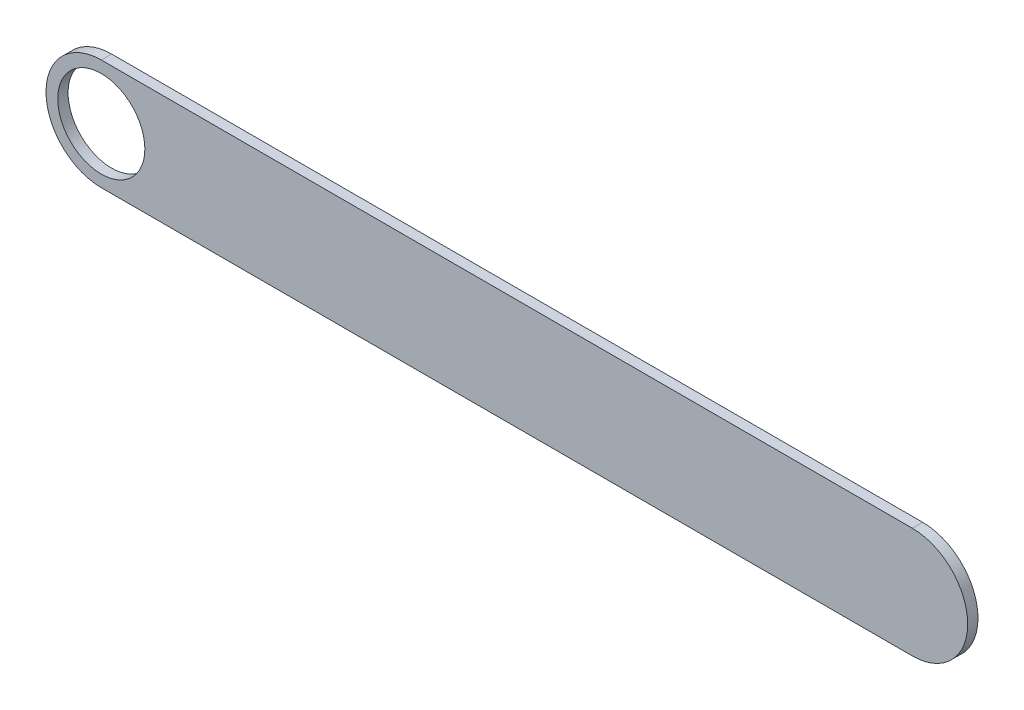
ISO-10303-21;
HEADER;
FILE_DESCRIPTION(('STEP AP214'),'2;1');
FILE_NAME('part.step','',(''),(''),'','','');
FILE_SCHEMA(('AUTOMOTIVE_DESIGN { 1 0 10303 214 1 1 1 1 }'));
ENDSEC;
DATA;
#1=APPLICATION_CONTEXT('core data for automotive mechanical design processes');
#2=APPLICATION_PROTOCOL_DEFINITION('international standard','automotive_design',2000,#1);
#3=PRODUCT_CONTEXT('',#1,'mechanical');
#4=PRODUCT('Part','Part','',(#3));
#5=PRODUCT_RELATED_PRODUCT_CATEGORY('part','',(#4));
#6=PRODUCT_DEFINITION_FORMATION('','',#4);
#7=PRODUCT_DEFINITION_CONTEXT('part definition',#1,'design');
#8=PRODUCT_DEFINITION('design','',#6,#7);
#9=PRODUCT_DEFINITION_SHAPE('','',#8);
#10=(LENGTH_UNIT() NAMED_UNIT(*) SI_UNIT(.MILLI.,.METRE.));
#11=(NAMED_UNIT(*) PLANE_ANGLE_UNIT() SI_UNIT($,.RADIAN.));
#12=(NAMED_UNIT(*) SI_UNIT($,.STERADIAN.) SOLID_ANGLE_UNIT());
#13=UNCERTAINTY_MEASURE_WITH_UNIT(LENGTH_MEASURE(1.E-05),#10,'distance_accuracy_value','');
#14=(GEOMETRIC_REPRESENTATION_CONTEXT(3) GLOBAL_UNCERTAINTY_ASSIGNED_CONTEXT((#13)) GLOBAL_UNIT_ASSIGNED_CONTEXT((#10,
#11,#12)) REPRESENTATION_CONTEXT('',''));
#15=CARTESIAN_POINT('',(0.,0.,0.));
#16=DIRECTION('',(0.,0.,1.));
#17=DIRECTION('',(1.,0.,0.));
#18=AXIS2_PLACEMENT_3D('',#15,#16,#17);
#19=CARTESIAN_POINT('',(27.178,12.2555,0.));
#20=DIRECTION('',(0.,1.,0.));
#21=DIRECTION('',(1.,0.,0.));
#22=AXIS2_PLACEMENT_3D('',#19,#20,#21);
#23=PLANE('',#22);
#24=DIRECTION('',(1.,0.,0.));
#25=VECTOR('',#24,1.);
#26=CARTESIAN_POINT('',(27.178,12.2555,0.03556));
#27=LINE('',#26,#25);
#28=CARTESIAN_POINT('',(27.178,12.2555,0.03556));
#29=VERTEX_POINT('',#28);
#30=CARTESIAN_POINT('',(29.972,12.2555,0.03556));
#31=VERTEX_POINT('',#30);
#32=EDGE_CURVE('E11',#29,#31,#27,.T.);
#33=ORIENTED_EDGE('',*,*,#32,.F.);
#34=DIRECTION('',(0.,0.,1.));
#35=VECTOR('',#34,1.);
#36=CARTESIAN_POINT('',(27.178,12.2555,0.));
#37=LINE('',#36,#35);
#38=CARTESIAN_POINT('',(27.178,12.2555,0.));
#39=VERTEX_POINT('',#38);
#40=EDGE_CURVE('E23',#39,#29,#37,.T.);
#41=ORIENTED_EDGE('',*,*,#40,.F.);
#42=DIRECTION('',(1.,0.,0.));
#43=VECTOR('',#42,1.);
#44=CARTESIAN_POINT('',(27.178,12.2555,0.));
#45=LINE('',#44,#43);
#46=CARTESIAN_POINT('',(29.972,12.2555,0.));
#47=VERTEX_POINT('',#46);
#48=EDGE_CURVE('E93',#39,#47,#45,.T.);
#49=ORIENTED_EDGE('',*,*,#48,.T.);
#50=DIRECTION('',(0.,0.,1.));
#51=VECTOR('',#50,1.);
#52=CARTESIAN_POINT('',(29.972,12.2555,0.));
#53=LINE('',#52,#51);
#54=EDGE_CURVE('E36',#47,#31,#53,.T.);
#55=ORIENTED_EDGE('',*,*,#54,.T.);
#56=EDGE_LOOP('',(#33,#41,#49,#55));
#57=FACE_BOUND('',#56,.T.);
#58=ADVANCED_FACE('F16',(#57),#23,.F.);
#59=CARTESIAN_POINT('',(27.178,12.446,0.));
#60=DIRECTION('',(0.,0.,-1.));
#61=DIRECTION('',(0.,1.,0.));
#62=AXIS2_PLACEMENT_3D('',#59,#60,#61);
#63=CYLINDRICAL_SURFACE('',#62,0.1905);
#64=CARTESIAN_POINT('',(27.178,12.446,0.03556));
#65=DIRECTION('',(0.,0.,1.));
#66=DIRECTION('',(0.,1.,0.));
#67=AXIS2_PLACEMENT_3D('',#64,#65,#66);
#68=CIRCLE('',#67,0.1905);
#69=CARTESIAN_POINT('',(27.178,12.6365,0.03556));
#70=VERTEX_POINT('',#69);
#71=EDGE_CURVE('E89',#70,#29,#68,.T.);
#72=ORIENTED_EDGE('',*,*,#71,.F.);
#73=DIRECTION('',(0.,0.,1.));
#74=VECTOR('',#73,1.);
#75=CARTESIAN_POINT('',(27.178,12.6365,0.));
#76=LINE('',#75,#74);
#77=CARTESIAN_POINT('',(27.178,12.6365,0.));
#78=VERTEX_POINT('',#77);
#79=EDGE_CURVE('E86',#78,#70,#76,.T.);
#80=ORIENTED_EDGE('',*,*,#79,.F.);
#81=CARTESIAN_POINT('',(27.178,12.446,0.));
#82=DIRECTION('',(0.,0.,1.));
#83=DIRECTION('',(0.,1.,0.));
#84=AXIS2_PLACEMENT_3D('',#81,#82,#83);
#85=CIRCLE('',#84,0.1905);
#86=EDGE_CURVE('E84',#78,#39,#85,.T.);
#87=ORIENTED_EDGE('',*,*,#86,.T.);
#88=ORIENTED_EDGE('',*,*,#40,.T.);
#89=EDGE_LOOP('',(#72,#80,#87,#88));
#90=FACE_BOUND('',#89,.T.);
#91=ADVANCED_FACE('F108',(#90),#63,.T.);
#92=CARTESIAN_POINT('',(29.972,12.446,0.));
#93=DIRECTION('',(0.,0.,-1.));
#94=DIRECTION('',(0.,-1.,0.));
#95=AXIS2_PLACEMENT_3D('',#92,#93,#94);
#96=CYLINDRICAL_SURFACE('',#95,0.1905);
#97=CARTESIAN_POINT('',(29.972,12.446,0.03556));
#98=DIRECTION('',(0.,0.,1.));
#99=DIRECTION('',(0.,-1.,0.));
#100=AXIS2_PLACEMENT_3D('',#97,#98,#99);
#101=CIRCLE('',#100,0.1905);
#102=CARTESIAN_POINT('',(29.972,12.6365,0.03556));
#103=VERTEX_POINT('',#102);
#104=EDGE_CURVE('E81',#31,#103,#101,.T.);
#105=ORIENTED_EDGE('',*,*,#104,.F.);
#106=ORIENTED_EDGE('',*,*,#54,.F.);
#107=CARTESIAN_POINT('',(29.972,12.446,0.));
#108=DIRECTION('',(0.,0.,1.));
#109=DIRECTION('',(0.,-1.,0.));
#110=AXIS2_PLACEMENT_3D('',#107,#108,#109);
#111=CIRCLE('',#110,0.1905);
#112=CARTESIAN_POINT('',(29.972,12.6365,0.));
#113=VERTEX_POINT('',#112);
#114=EDGE_CURVE('E78',#47,#113,#111,.T.);
#115=ORIENTED_EDGE('',*,*,#114,.T.);
#116=DIRECTION('',(0.,0.,1.));
#117=VECTOR('',#116,1.);
#118=CARTESIAN_POINT('',(29.972,12.6365,0.));
#119=LINE('',#118,#117);
#120=EDGE_CURVE('E76',#113,#103,#119,.T.);
#121=ORIENTED_EDGE('',*,*,#120,.T.);
#122=EDGE_LOOP('',(#105,#106,#115,#121));
#123=FACE_BOUND('',#122,.T.);
#124=ADVANCED_FACE('F101',(#123),#96,.T.);
#125=CARTESIAN_POINT('',(29.972,12.6365,0.));
#126=DIRECTION('',(0.,-1.,0.));
#127=DIRECTION('',(-1.,0.,0.));
#128=AXIS2_PLACEMENT_3D('',#125,#126,#127);
#129=PLANE('',#128);
#130=DIRECTION('',(-1.,0.,0.));
#131=VECTOR('',#130,1.);
#132=CARTESIAN_POINT('',(29.972,12.6365,0.03556));
#133=LINE('',#132,#131);
#134=EDGE_CURVE('E74',#103,#70,#133,.T.);
#135=ORIENTED_EDGE('',*,*,#134,.F.);
#136=ORIENTED_EDGE('',*,*,#120,.F.);
#137=DIRECTION('',(-1.,0.,0.));
#138=VECTOR('',#137,1.);
#139=CARTESIAN_POINT('',(29.972,12.6365,0.));
#140=LINE('',#139,#138);
#141=EDGE_CURVE('E71',#113,#78,#140,.T.);
#142=ORIENTED_EDGE('',*,*,#141,.T.);
#143=ORIENTED_EDGE('',*,*,#79,.T.);
#144=EDGE_LOOP('',(#135,#136,#142,#143));
#145=FACE_BOUND('',#144,.T.);
#146=ADVANCED_FACE('F107',(#145),#129,.F.);
#147=CARTESIAN_POINT('',(27.178,12.446,0.));
#148=DIRECTION('',(0.,0.,-1.));
#149=DIRECTION('',(1.,0.,0.));
#150=AXIS2_PLACEMENT_3D('',#147,#148,#149);
#151=CYLINDRICAL_SURFACE('',#150,0.1499997);
#152=DIRECTION('',(0.,0.,1.));
#153=VECTOR('',#152,1.);
#154=CARTESIAN_POINT('',(27.3279997,12.446,0.));
#155=LINE('',#154,#153);
#156=CARTESIAN_POINT('',(27.3279997,12.446,0.));
#157=VERTEX_POINT('',#156);
#158=CARTESIAN_POINT('',(27.3279997,12.446,0.03556));
#159=VERTEX_POINT('',#158);
#160=EDGE_CURVE('E67',#157,#159,#155,.T.);
#161=ORIENTED_EDGE('',*,*,#160,.T.);
#162=CARTESIAN_POINT('',(27.178,12.446,0.03556));
#163=DIRECTION('',(0.,0.,1.));
#164=DIRECTION('',(1.,0.,0.));
#165=AXIS2_PLACEMENT_3D('',#162,#163,#164);
#166=CIRCLE('',#165,0.1499997);
#167=EDGE_CURVE('E64',#159,#159,#166,.T.);
#168=ORIENTED_EDGE('',*,*,#167,.T.);
#169=ORIENTED_EDGE('',*,*,#160,.F.);
#170=CARTESIAN_POINT('',(27.178,12.446,0.));
#171=DIRECTION('',(0.,0.,1.));
#172=DIRECTION('',(1.,0.,0.));
#173=AXIS2_PLACEMENT_3D('',#170,#171,#172);
#174=CIRCLE('',#173,0.1499997);
#175=EDGE_CURVE('E60',#157,#157,#174,.T.);
#176=ORIENTED_EDGE('',*,*,#175,.F.);
#177=EDGE_LOOP('',(#161,#168,#169,#176));
#178=FACE_BOUND('',#177,.T.);
#179=ADVANCED_FACE('F119',(#178),#151,.F.);
#180=CARTESIAN_POINT('',(28.575,12.446,0.));
#181=DIRECTION('',(0.,0.,1.));
#182=DIRECTION('',(1.,0.,0.));
#183=AXIS2_PLACEMENT_3D('',#180,#181,#182);
#184=PLANE('',#183);
#185=ORIENTED_EDGE('',*,*,#141,.F.);
#186=ORIENTED_EDGE('',*,*,#114,.F.);
#187=ORIENTED_EDGE('',*,*,#48,.F.);
#188=ORIENTED_EDGE('',*,*,#86,.F.);
#189=EDGE_LOOP('',(#185,#186,#187,#188));
#190=FACE_BOUND('',#189,.T.);
#191=ORIENTED_EDGE('',*,*,#175,.T.);
#192=EDGE_LOOP('',(#191));
#193=FACE_BOUND('',#192,.T.);
#194=ADVANCED_FACE('F61',(#190,#193),#184,.F.);
#195=CARTESIAN_POINT('',(28.575,12.446,0.03556));
#196=DIRECTION('',(0.,0.,1.));
#197=DIRECTION('',(1.,0.,0.));
#198=AXIS2_PLACEMENT_3D('',#195,#196,#197);
#199=PLANE('',#198);
#200=ORIENTED_EDGE('',*,*,#32,.T.);
#201=ORIENTED_EDGE('',*,*,#104,.T.);
#202=ORIENTED_EDGE('',*,*,#134,.T.);
#203=ORIENTED_EDGE('',*,*,#71,.T.);
#204=EDGE_LOOP('',(#200,#201,#202,#203));
#205=FACE_BOUND('',#204,.T.);
#206=ORIENTED_EDGE('',*,*,#167,.F.);
#207=EDGE_LOOP('',(#206));
#208=FACE_BOUND('',#207,.T.);
#209=ADVANCED_FACE('F104',(#205,#208),#199,.T.);
#210=CLOSED_SHELL('',(#58,#91,#124,#146,#179,#194,#209));
#211=MANIFOLD_SOLID_BREP('B1',#210);
#212=ADVANCED_BREP_SHAPE_REPRESENTATION('',(#18,#211),#14);
#213=SHAPE_DEFINITION_REPRESENTATION(#9,#212);
ENDSEC;
END-ISO-10303-21;
